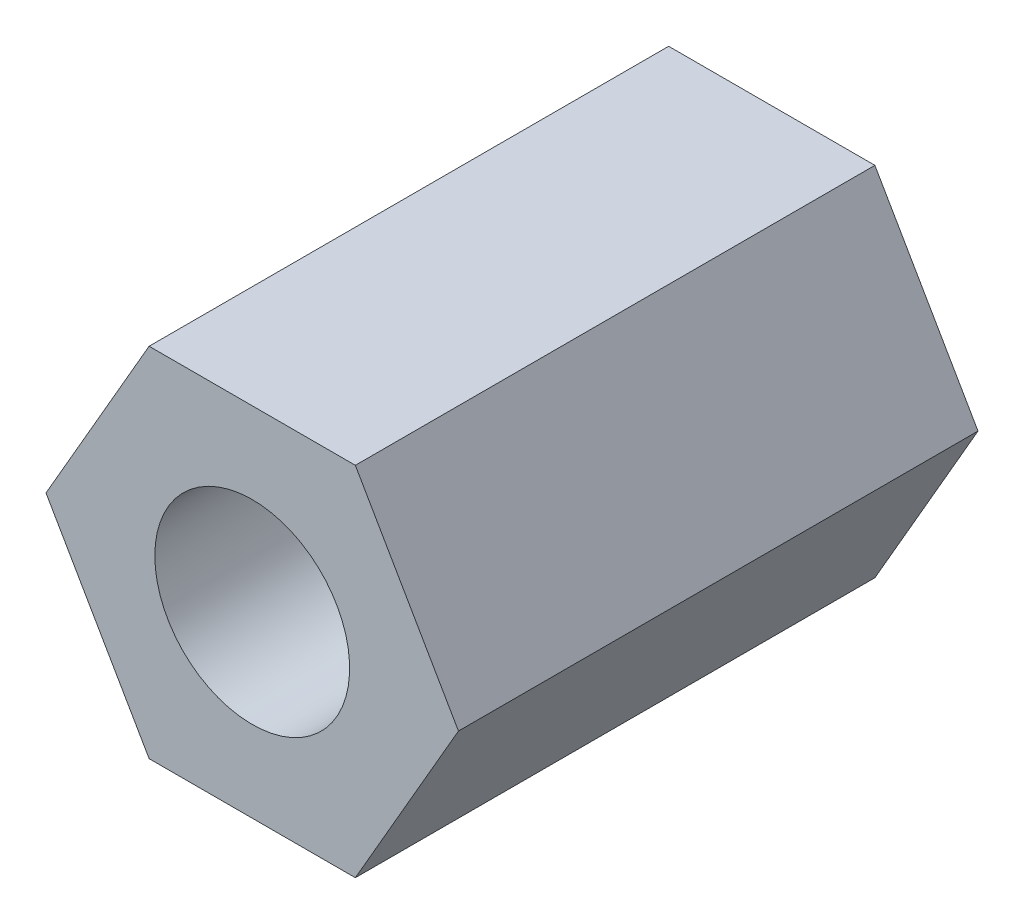
ISO-10303-21;
HEADER;
FILE_DESCRIPTION(('STEP AP214'),'2;1');
FILE_NAME('part.step','',(''),(''),'','','');
FILE_SCHEMA(('AUTOMOTIVE_DESIGN { 1 0 10303 214 1 1 1 1 }'));
ENDSEC;
DATA;
#1=APPLICATION_CONTEXT('core data for automotive mechanical design processes');
#2=APPLICATION_PROTOCOL_DEFINITION('international standard','automotive_design',2000,#1);
#3=PRODUCT_CONTEXT('',#1,'mechanical');
#4=PRODUCT('Part','Part','',(#3));
#5=PRODUCT_RELATED_PRODUCT_CATEGORY('part','',(#4));
#6=PRODUCT_DEFINITION_FORMATION('','',#4);
#7=PRODUCT_DEFINITION_CONTEXT('part definition',#1,'design');
#8=PRODUCT_DEFINITION('design','',#6,#7);
#9=PRODUCT_DEFINITION_SHAPE('','',#8);
#10=(LENGTH_UNIT() NAMED_UNIT(*) SI_UNIT(.MILLI.,.METRE.));
#11=(NAMED_UNIT(*) PLANE_ANGLE_UNIT() SI_UNIT($,.RADIAN.));
#12=(NAMED_UNIT(*) SI_UNIT($,.STERADIAN.) SOLID_ANGLE_UNIT());
#13=UNCERTAINTY_MEASURE_WITH_UNIT(LENGTH_MEASURE(1.E-05),#10,'distance_accuracy_value','');
#14=(GEOMETRIC_REPRESENTATION_CONTEXT(3) GLOBAL_UNCERTAINTY_ASSIGNED_CONTEXT((#13)) GLOBAL_UNIT_ASSIGNED_CONTEXT((#10,
#11,#12)) REPRESENTATION_CONTEXT('',''));
#15=CARTESIAN_POINT('',(0.,0.,0.));
#16=DIRECTION('',(0.,0.,1.));
#17=DIRECTION('',(1.,0.,0.));
#18=AXIS2_PLACEMENT_3D('',#15,#16,#17);
#19=CARTESIAN_POINT('',(3.17542648054304,0.,7.99999999999998));
#20=DIRECTION('',(-0.866025403784437,-0.500000000000002,0.));
#21=DIRECTION('',(0.499999999999997,-0.866025403784436,0.));
#22=AXIS2_PLACEMENT_3D('',#19,#20,#21);
#23=PLANE('',#22);
#24=DIRECTION('',(-0.499999999999997,0.866025403784436,0.));
#25=VECTOR('',#24,1.);
#26=CARTESIAN_POINT('',(3.17542648054298,0.,0.));
#27=LINE('',#26,#25);
#28=CARTESIAN_POINT('',(3.17542648054298,0.,0.));
#29=VERTEX_POINT('',#28);
#30=CARTESIAN_POINT('',(1.58771324027158,2.75000000000004,0.));
#31=VERTEX_POINT('',#30);
#32=EDGE_CURVE('E116',#29,#31,#27,.T.);
#33=ORIENTED_EDGE('',*,*,#32,.T.);
#34=DIRECTION('',(0.,0.,-0.999999999999998));
#35=VECTOR('',#34,1.);
#36=CARTESIAN_POINT('',(1.58771324027147,2.75000000000004,7.99999999999999));
#37=LINE('',#36,#35);
#38=CARTESIAN_POINT('',(1.58771324027147,2.75000000000004,7.99999999999999));
#39=VERTEX_POINT('',#38);
#40=EDGE_CURVE('E11',#39,#31,#37,.T.);
#41=ORIENTED_EDGE('',*,*,#40,.F.);
#42=DIRECTION('',(-0.499999999999997,0.866025403784436,0.));
#43=VECTOR('',#42,1.);
#44=CARTESIAN_POINT('',(3.17542648054304,0.,7.99999999999998));
#45=LINE('',#44,#43);
#46=CARTESIAN_POINT('',(3.17542648054304,0.,7.99999999999998));
#47=VERTEX_POINT('',#46);
#48=EDGE_CURVE('E127',#47,#39,#45,.T.);
#49=ORIENTED_EDGE('',*,*,#48,.F.);
#50=DIRECTION('',(0.,0.,-0.999999999999998));
#51=VECTOR('',#50,1.);
#52=CARTESIAN_POINT('',(3.17542648054304,0.,7.99999999999998));
#53=LINE('',#52,#51);
#54=EDGE_CURVE('E112',#47,#29,#53,.T.);
#55=ORIENTED_EDGE('',*,*,#54,.T.);
#56=EDGE_LOOP('',(#33,#41,#49,#55));
#57=FACE_BOUND('',#56,.T.);
#58=ADVANCED_FACE('F32',(#57),#23,.F.);
#59=CARTESIAN_POINT('',(1.58771324027147,2.75000000000004,7.99999999999999));
#60=DIRECTION('',(0.,-0.999999999999999,0.));
#61=DIRECTION('',(0.,0.,-0.999999999999998));
#62=AXIS2_PLACEMENT_3D('',#59,#60,#61);
#63=PLANE('',#62);
#64=DIRECTION('',(-0.999999999999997,0.,0.));
#65=VECTOR('',#64,1.);
#66=CARTESIAN_POINT('',(1.58771324027158,2.75000000000004,0.));
#67=LINE('',#66,#65);
#68=CARTESIAN_POINT('',(-1.58771324027131,2.74999999999999,0.));
#69=VERTEX_POINT('',#68);
#70=EDGE_CURVE('E119',#31,#69,#67,.T.);
#71=ORIENTED_EDGE('',*,*,#70,.T.);
#72=DIRECTION('',(0.,0.,-0.999999999999998));
#73=VECTOR('',#72,1.);
#74=CARTESIAN_POINT('',(-1.58771324027139,2.75000000000006,8.00000000000001));
#75=LINE('',#74,#73);
#76=CARTESIAN_POINT('',(-1.58771324027139,2.75000000000006,8.00000000000001));
#77=VERTEX_POINT('',#76);
#78=EDGE_CURVE('E40',#77,#69,#75,.T.);
#79=ORIENTED_EDGE('',*,*,#78,.F.);
#80=DIRECTION('',(-0.999999999999997,0.,0.));
#81=VECTOR('',#80,1.);
#82=CARTESIAN_POINT('',(1.58771324027147,2.75000000000004,7.99999999999999));
#83=LINE('',#82,#81);
#84=EDGE_CURVE('E85',#39,#77,#83,.T.);
#85=ORIENTED_EDGE('',*,*,#84,.F.);
#86=ORIENTED_EDGE('',*,*,#40,.T.);
#87=EDGE_LOOP('',(#71,#79,#85,#86));
#88=FACE_BOUND('',#87,.T.);
#89=ADVANCED_FACE('F152',(#88),#63,.F.);
#90=CARTESIAN_POINT('',(-1.58771324027139,2.75000000000006,8.00000000000001));
#91=DIRECTION('',(0.866025403784435,-0.499999999999998,0.));
#92=DIRECTION('',(0.5,0.866025403784438,0.));
#93=AXIS2_PLACEMENT_3D('',#90,#91,#92);
#94=PLANE('',#93);
#95=DIRECTION('',(-0.5,-0.866025403784438,0.));
#96=VECTOR('',#95,1.);
#97=CARTESIAN_POINT('',(-1.58771324027131,2.74999999999999,0.));
#98=LINE('',#97,#96);
#99=CARTESIAN_POINT('',(-3.17542648054278,0.,0.));
#100=VERTEX_POINT('',#99);
#101=EDGE_CURVE('E122',#69,#100,#98,.T.);
#102=ORIENTED_EDGE('',*,*,#101,.T.);
#103=DIRECTION('',(0.,0.,-0.999999999999998));
#104=VECTOR('',#103,1.);
#105=CARTESIAN_POINT('',(-3.17542648054285,1.38777878078145E-13,8.00000000000001));
#106=LINE('',#105,#104);
#107=CARTESIAN_POINT('',(-3.17542648054285,1.38777878078145E-13,8.00000000000001));
#108=VERTEX_POINT('',#107);
#109=EDGE_CURVE('E107',#108,#100,#106,.T.);
#110=ORIENTED_EDGE('',*,*,#109,.F.);
#111=DIRECTION('',(-0.5,-0.866025403784438,0.));
#112=VECTOR('',#111,1.);
#113=CARTESIAN_POINT('',(-1.58771324027139,2.75000000000006,8.00000000000001));
#114=LINE('',#113,#112);
#115=EDGE_CURVE('E98',#77,#108,#114,.T.);
#116=ORIENTED_EDGE('',*,*,#115,.F.);
#117=ORIENTED_EDGE('',*,*,#78,.T.);
#118=EDGE_LOOP('',(#102,#110,#116,#117));
#119=FACE_BOUND('',#118,.T.);
#120=ADVANCED_FACE('F133',(#119),#94,.F.);
#121=CARTESIAN_POINT('',(-3.17542648054285,1.38777878078145E-13,8.00000000000001));
#122=DIRECTION('',(0.866025403784437,0.500000000000002,0.));
#123=DIRECTION('',(-0.499999999999997,0.866025403784436,0.));
#124=AXIS2_PLACEMENT_3D('',#121,#122,#123);
#125=PLANE('',#124);
#126=DIRECTION('',(0.499999999999997,-0.866025403784436,0.));
#127=VECTOR('',#126,1.);
#128=CARTESIAN_POINT('',(-3.17542648054278,0.,0.));
#129=LINE('',#128,#127);
#130=CARTESIAN_POINT('',(-1.58771324027146,-2.75000000000002,0.));
#131=VERTEX_POINT('',#130);
#132=EDGE_CURVE('E106',#100,#131,#129,.T.);
#133=ORIENTED_EDGE('',*,*,#132,.T.);
#134=DIRECTION('',(0.,0.,-0.999999999999998));
#135=VECTOR('',#134,1.);
#136=CARTESIAN_POINT('',(-1.58771324027146,-2.75000000000002,7.99999999999999));
#137=LINE('',#136,#135);
#138=CARTESIAN_POINT('',(-1.58771324027146,-2.75000000000002,7.99999999999999));
#139=VERTEX_POINT('',#138);
#140=EDGE_CURVE('E103',#139,#131,#137,.T.);
#141=ORIENTED_EDGE('',*,*,#140,.F.);
#142=DIRECTION('',(0.499999999999997,-0.866025403784436,0.));
#143=VECTOR('',#142,1.);
#144=CARTESIAN_POINT('',(-3.17542648054285,1.38777878078145E-13,8.00000000000001));
#145=LINE('',#144,#143);
#146=EDGE_CURVE('E92',#108,#139,#145,.T.);
#147=ORIENTED_EDGE('',*,*,#146,.F.);
#148=ORIENTED_EDGE('',*,*,#109,.T.);
#149=EDGE_LOOP('',(#133,#141,#147,#148));
#150=FACE_BOUND('',#149,.T.);
#151=ADVANCED_FACE('F104',(#150),#125,.F.);
#152=CARTESIAN_POINT('',(-1.58771324027146,-2.75000000000002,7.99999999999999));
#153=DIRECTION('',(0.,0.999999999999999,0.));
#154=DIRECTION('',(0.,0.,0.999999999999998));
#155=AXIS2_PLACEMENT_3D('',#152,#153,#154);
#156=PLANE('',#155);
#157=DIRECTION('',(0.999999999999997,0.,0.));
#158=VECTOR('',#157,1.);
#159=CARTESIAN_POINT('',(-1.58771324027146,-2.75000000000002,0.));
#160=LINE('',#159,#158);
#161=CARTESIAN_POINT('',(1.58771324027161,-2.75000000000002,0.));
#162=VERTEX_POINT('',#161);
#163=EDGE_CURVE('E71',#131,#162,#160,.T.);
#164=ORIENTED_EDGE('',*,*,#163,.T.);
#165=DIRECTION('',(0.,0.,-0.999999999999998));
#166=VECTOR('',#165,1.);
#167=CARTESIAN_POINT('',(1.58771324027156,-2.75,7.99999999999999));
#168=LINE('',#167,#166);
#169=CARTESIAN_POINT('',(1.58771324027156,-2.75,7.99999999999999));
#170=VERTEX_POINT('',#169);
#171=EDGE_CURVE('E108',#170,#162,#168,.T.);
#172=ORIENTED_EDGE('',*,*,#171,.F.);
#173=DIRECTION('',(0.999999999999997,0.,0.));
#174=VECTOR('',#173,1.);
#175=CARTESIAN_POINT('',(-1.58771324027146,-2.75000000000002,7.99999999999999));
#176=LINE('',#175,#174);
#177=EDGE_CURVE('E96',#139,#170,#176,.T.);
#178=ORIENTED_EDGE('',*,*,#177,.F.);
#179=ORIENTED_EDGE('',*,*,#140,.T.);
#180=EDGE_LOOP('',(#164,#172,#178,#179));
#181=FACE_BOUND('',#180,.T.);
#182=ADVANCED_FACE('F110',(#181),#156,.F.);
#183=CARTESIAN_POINT('',(1.58771324027156,-2.75,7.99999999999999));
#184=DIRECTION('',(-0.866025403784435,0.499999999999997,0.));
#185=DIRECTION('',(-0.500000000000001,-0.866025403784438,0.));
#186=AXIS2_PLACEMENT_3D('',#183,#184,#185);
#187=PLANE('',#186);
#188=DIRECTION('',(0.500000000000001,0.866025403784438,0.));
#189=VECTOR('',#188,1.);
#190=CARTESIAN_POINT('',(1.58771324027161,-2.75000000000002,0.));
#191=LINE('',#190,#189);
#192=EDGE_CURVE('E77',#162,#29,#191,.T.);
#193=ORIENTED_EDGE('',*,*,#192,.T.);
#194=ORIENTED_EDGE('',*,*,#54,.F.);
#195=DIRECTION('',(0.500000000000001,0.866025403784438,0.));
#196=VECTOR('',#195,1.);
#197=CARTESIAN_POINT('',(1.58771324027156,-2.75,7.99999999999999));
#198=LINE('',#197,#196);
#199=EDGE_CURVE('E48',#170,#47,#198,.T.);
#200=ORIENTED_EDGE('',*,*,#199,.F.);
#201=ORIENTED_EDGE('',*,*,#171,.T.);
#202=EDGE_LOOP('',(#193,#194,#200,#201));
#203=FACE_BOUND('',#202,.T.);
#204=ADVANCED_FACE('F140',(#203),#187,.F.);
#205=CARTESIAN_POINT('',(3.17542648054304,0.,7.99999999999998));
#206=DIRECTION('',(0.,0.,-0.999999999999998));
#207=DIRECTION('',(-0.999999999999997,0.,0.));
#208=AXIS2_PLACEMENT_3D('',#205,#206,#207);
#209=PLANE('',#208);
#210=CARTESIAN_POINT('',(0.,0.,7.99999999999999));
#211=DIRECTION('',(0.,0.,-0.999999999999998));
#212=DIRECTION('',(-0.999999999999997,0.,0.));
#213=AXIS2_PLACEMENT_3D('',#210,#211,#212);
#214=CIRCLE('',#213,1.5);
#215=CARTESIAN_POINT('',(-1.49999999999994,0.,7.99999999999998));
#216=VERTEX_POINT('',#215);
#217=EDGE_CURVE('E120',#216,#216,#214,.T.);
#218=ORIENTED_EDGE('',*,*,#217,.T.);
#219=EDGE_LOOP('',(#218));
#220=FACE_BOUND('',#219,.T.);
#221=ORIENTED_EDGE('',*,*,#48,.T.);
#222=ORIENTED_EDGE('',*,*,#84,.T.);
#223=ORIENTED_EDGE('',*,*,#115,.T.);
#224=ORIENTED_EDGE('',*,*,#146,.T.);
#225=ORIENTED_EDGE('',*,*,#177,.T.);
#226=ORIENTED_EDGE('',*,*,#199,.T.);
#227=EDGE_LOOP('',(#221,#222,#223,#224,#225,#226));
#228=FACE_BOUND('',#227,.T.);
#229=ADVANCED_FACE('F94',(#220,#228),#209,.F.);
#230=CARTESIAN_POINT('',(3.17542648054298,0.,0.));
#231=DIRECTION('',(0.,0.,-0.999999999999998));
#232=DIRECTION('',(-0.999999999999997,0.,0.));
#233=AXIS2_PLACEMENT_3D('',#230,#231,#232);
#234=PLANE('',#233);
#235=CARTESIAN_POINT('',(0.,0.,0.));
#236=DIRECTION('',(0.,0.,-0.999999999999998));
#237=DIRECTION('',(-0.999999999999997,0.,0.));
#238=AXIS2_PLACEMENT_3D('',#235,#236,#237);
#239=CIRCLE('',#238,1.5);
#240=CARTESIAN_POINT('',(-1.49999999999993,0.,0.));
#241=VERTEX_POINT('',#240);
#242=EDGE_CURVE('E207',#241,#241,#239,.T.);
#243=ORIENTED_EDGE('',*,*,#242,.F.);
#244=EDGE_LOOP('',(#243));
#245=FACE_BOUND('',#244,.T.);
#246=ORIENTED_EDGE('',*,*,#32,.F.);
#247=ORIENTED_EDGE('',*,*,#192,.F.);
#248=ORIENTED_EDGE('',*,*,#163,.F.);
#249=ORIENTED_EDGE('',*,*,#132,.F.);
#250=ORIENTED_EDGE('',*,*,#101,.F.);
#251=ORIENTED_EDGE('',*,*,#70,.F.);
#252=EDGE_LOOP('',(#246,#247,#248,#249,#250,#251));
#253=FACE_BOUND('',#252,.T.);
#254=ADVANCED_FACE('F136',(#245,#253),#234,.T.);
#255=CARTESIAN_POINT('',(0.,0.,7.99999999999999));
#256=DIRECTION('',(0.,0.,-0.999999999999998));
#257=DIRECTION('',(-0.999999999999997,0.,0.));
#258=AXIS2_PLACEMENT_3D('',#255,#256,#257);
#259=CYLINDRICAL_SURFACE('',#258,1.5);
#260=CARTESIAN_POINT('',(-1.49999999999994,0.,7.99999999999998));
#261=CARTESIAN_POINT('',(-1.49999999999994,0.,7.91666666666665));
#262=CARTESIAN_POINT('',(-1.49999999999994,0.,7.83333333333332));
#263=CARTESIAN_POINT('',(-1.49999999999994,0.,7.66666666666665));
#264=CARTESIAN_POINT('',(-1.49999999999994,0.,7.58333333333332));
#265=CARTESIAN_POINT('',(-1.49999999999994,0.,7.41666666666665));
#266=CARTESIAN_POINT('',(-1.49999999999994,0.,7.33333333333332));
#267=CARTESIAN_POINT('',(-1.49999999999994,0.,7.16666666666665));
#268=CARTESIAN_POINT('',(-1.49999999999994,0.,7.08333333333332));
#269=CARTESIAN_POINT('',(-1.49999999999994,0.,6.91666666666665));
#270=CARTESIAN_POINT('',(-1.49999999999994,0.,6.83333333333332));
#271=CARTESIAN_POINT('',(-1.49999999999994,0.,6.66666666666665));
#272=CARTESIAN_POINT('',(-1.49999999999994,0.,6.58333333333332));
#273=CARTESIAN_POINT('',(-1.49999999999994,0.,6.41666666666665));
#274=CARTESIAN_POINT('',(-1.49999999999994,0.,6.33333333333332));
#275=CARTESIAN_POINT('',(-1.49999999999994,0.,6.16666666666666));
#276=CARTESIAN_POINT('',(-1.49999999999994,0.,6.08333333333332));
#277=CARTESIAN_POINT('',(-1.49999999999994,0.,5.91666666666666));
#278=CARTESIAN_POINT('',(-1.49999999999994,0.,5.83333333333332));
#279=CARTESIAN_POINT('',(-1.49999999999994,0.,5.66666666666666));
#280=CARTESIAN_POINT('',(-1.49999999999994,0.,5.58333333333332));
#281=CARTESIAN_POINT('',(-1.49999999999994,0.,5.41666666666666));
#282=CARTESIAN_POINT('',(-1.49999999999994,0.,5.33333333333332));
#283=CARTESIAN_POINT('',(-1.49999999999994,0.,5.16666666666666));
#284=CARTESIAN_POINT('',(-1.49999999999994,0.,5.08333333333332));
#285=CARTESIAN_POINT('',(-1.49999999999994,0.,4.91666666666666));
#286=CARTESIAN_POINT('',(-1.49999999999994,0.,4.83333333333332));
#287=CARTESIAN_POINT('',(-1.49999999999994,0.,4.66666666666666));
#288=CARTESIAN_POINT('',(-1.49999999999994,0.,4.58333333333333));
#289=CARTESIAN_POINT('',(-1.49999999999994,0.,4.41666666666666));
#290=CARTESIAN_POINT('',(-1.49999999999994,0.,4.33333333333333));
#291=CARTESIAN_POINT('',(-1.49999999999994,0.,4.16666666666666));
#292=CARTESIAN_POINT('',(-1.49999999999994,0.,4.08333333333333));
#293=CARTESIAN_POINT('',(-1.49999999999994,0.,3.91666666666666));
#294=CARTESIAN_POINT('',(-1.49999999999994,0.,3.83333333333333));
#295=CARTESIAN_POINT('',(-1.49999999999994,0.,3.66666666666666));
#296=CARTESIAN_POINT('',(-1.49999999999994,0.,3.58333333333333));
#297=CARTESIAN_POINT('',(-1.49999999999994,0.,3.41666666666666));
#298=CARTESIAN_POINT('',(-1.49999999999993,0.,3.33333333333333));
#299=CARTESIAN_POINT('',(-1.49999999999993,0.,3.16666666666666));
#300=CARTESIAN_POINT('',(-1.49999999999993,0.,3.08333333333333));
#301=CARTESIAN_POINT('',(-1.49999999999993,0.,2.91666666666666));
#302=CARTESIAN_POINT('',(-1.49999999999993,0.,2.83333333333333));
#303=CARTESIAN_POINT('',(-1.49999999999993,0.,2.66666666666666));
#304=CARTESIAN_POINT('',(-1.49999999999993,0.,2.58333333333333));
#305=CARTESIAN_POINT('',(-1.49999999999993,0.,2.41666666666666));
#306=CARTESIAN_POINT('',(-1.49999999999993,0.,2.33333333333333));
#307=CARTESIAN_POINT('',(-1.49999999999993,0.,2.16666666666666));
#308=CARTESIAN_POINT('',(-1.49999999999993,0.,2.08333333333333));
#309=CARTESIAN_POINT('',(-1.49999999999993,0.,1.91666666666666));
#310=CARTESIAN_POINT('',(-1.49999999999993,0.,1.83333333333333));
#311=CARTESIAN_POINT('',(-1.49999999999993,0.,1.66666666666666));
#312=CARTESIAN_POINT('',(-1.49999999999993,0.,1.58333333333333));
#313=CARTESIAN_POINT('',(-1.49999999999993,0.,1.41666666666666));
#314=CARTESIAN_POINT('',(-1.49999999999993,0.,1.33333333333333));
#315=CARTESIAN_POINT('',(-1.49999999999993,0.,1.16666666666666));
#316=CARTESIAN_POINT('',(-1.49999999999993,0.,1.08333333333333));
#317=CARTESIAN_POINT('',(-1.49999999999993,0.,0.916666666666664));
#318=CARTESIAN_POINT('',(-1.49999999999993,0.,0.833333333333331));
#319=CARTESIAN_POINT('',(-1.49999999999993,0.,0.666666666666665));
#320=CARTESIAN_POINT('',(-1.49999999999993,0.,0.583333333333332));
#321=CARTESIAN_POINT('',(-1.49999999999993,0.,0.416666666666666));
#322=CARTESIAN_POINT('',(-1.49999999999993,0.,0.333333333333332));
#323=CARTESIAN_POINT('',(-1.49999999999993,0.,0.166666666666666));
#324=CARTESIAN_POINT('',(-1.49999999999993,0.,0.083333333333332));
#325=CARTESIAN_POINT('',(-1.49999999999993,0.,0.));
#326=B_SPLINE_CURVE_WITH_KNOTS('',3,(#260,#261,#262,#263,#264,#265,#266,#267,#268,#269,#270,
#271,#272,#273,#274,#275,#276,#277,#278,#279,#280,#281,#282,#283,#284,#285,#286,#287,#288,#289,
#290,#291,#292,#293,#294,#295,#296,#297,#298,#299,#300,#301,#302,#303,#304,#305,#306,#307,#308,
#309,#310,#311,#312,#313,#314,#315,#316,#317,#318,#319,#320,#321,#322,#323,#324,#325),
.UNSPECIFIED.,.F.,.F.,(4,2,2,2,2,2,2,2,2,2,2,2,2,2,2,2,2,2,2,2,2,2,2,2,2,2,2,2,2,2,2,2,4),(0.,
0.249999999999999,0.499999999999999,0.749999999999998,0.999999999999997,1.25,1.5,1.75,2.,2.25,
2.5,2.74999999999999,2.99999999999999,3.24999999999999,3.49999999999999,3.74999999999999,
3.99999999999999,4.24999999999999,4.49999999999999,4.74999999999999,4.99999999999999,
5.24999999999999,5.49999999999999,5.74999999999999,5.99999999999999,6.24999999999999,
6.49999999999999,6.74999999999999,6.99999999999999,7.24999999999999,7.49999999999999,
7.74999999999998,7.99999999999999),.UNSPECIFIED.);
#327=EDGE_CURVE('BSEAM189',#216,#241,#326,.T.);
#328=ORIENTED_EDGE('',*,*,#217,.F.);
#329=ORIENTED_EDGE('',*,*,#242,.T.);
#330=ORIENTED_EDGE('',*,*,#327,.T.);
#331=ORIENTED_EDGE('',*,*,#327,.F.);
#332=EDGE_LOOP('',(#328,#330,#329,#331));
#333=FACE_BOUND('',#332,.T.);
#334=ADVANCED_FACE('F189',(#333),#259,.F.);
#335=CLOSED_SHELL('',(#58,#89,#120,#151,#182,#204,#229,#254,#334));
#336=MANIFOLD_SOLID_BREP('B2',#335);
#337=ADVANCED_BREP_SHAPE_REPRESENTATION('',(#18,#336),#14);
#338=SHAPE_DEFINITION_REPRESENTATION(#9,#337);
ENDSEC;
END-ISO-10303-21;
